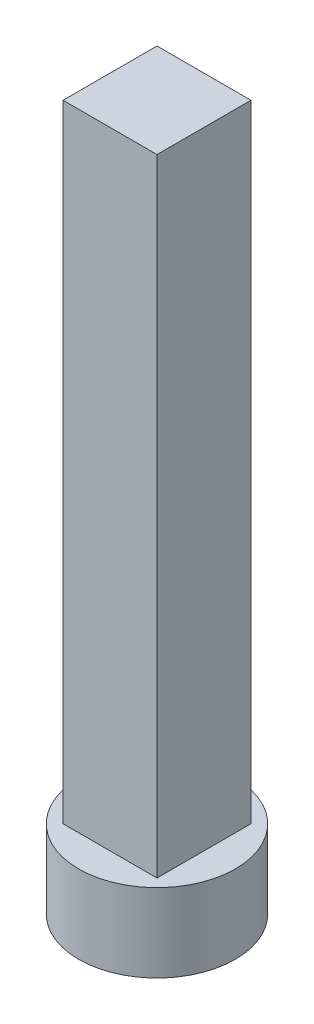
ISO-10303-21;
HEADER;
FILE_DESCRIPTION(('STEP AP214'),'2;1');
FILE_NAME('part.step','',(''),(''),'','','');
FILE_SCHEMA(('AUTOMOTIVE_DESIGN { 1 0 10303 214 1 1 1 1 }'));
ENDSEC;
DATA;
#1=APPLICATION_CONTEXT('core data for automotive mechanical design processes');
#2=APPLICATION_PROTOCOL_DEFINITION('international standard','automotive_design',2000,#1);
#3=PRODUCT_CONTEXT('',#1,'mechanical');
#4=PRODUCT('Part','Part','',(#3));
#5=PRODUCT_RELATED_PRODUCT_CATEGORY('part','',(#4));
#6=PRODUCT_DEFINITION_FORMATION('','',#4);
#7=PRODUCT_DEFINITION_CONTEXT('part definition',#1,'design');
#8=PRODUCT_DEFINITION('design','',#6,#7);
#9=PRODUCT_DEFINITION_SHAPE('','',#8);
#10=(LENGTH_UNIT() NAMED_UNIT(*) SI_UNIT(.MILLI.,.METRE.));
#11=(NAMED_UNIT(*) PLANE_ANGLE_UNIT() SI_UNIT($,.RADIAN.));
#12=(NAMED_UNIT(*) SI_UNIT($,.STERADIAN.) SOLID_ANGLE_UNIT());
#13=UNCERTAINTY_MEASURE_WITH_UNIT(LENGTH_MEASURE(1.E-05),#10,'distance_accuracy_value','');
#14=(GEOMETRIC_REPRESENTATION_CONTEXT(3) GLOBAL_UNCERTAINTY_ASSIGNED_CONTEXT((#13)) GLOBAL_UNIT_ASSIGNED_CONTEXT((#10,
#11,#12)) REPRESENTATION_CONTEXT('',''));
#15=CARTESIAN_POINT('',(0.,0.,0.));
#16=DIRECTION('',(0.,0.,1.));
#17=DIRECTION('',(1.,0.,0.));
#18=AXIS2_PLACEMENT_3D('',#15,#16,#17);
#19=CARTESIAN_POINT('',(30.,400.,-30.));
#20=DIRECTION('',(-1.,0.,0.));
#21=DIRECTION('',(0.,0.,1.));
#22=AXIS2_PLACEMENT_3D('',#19,#20,#21);
#23=PLANE('',#22);
#24=DIRECTION('',(0.,0.,-1.));
#25=VECTOR('',#24,1.);
#26=CARTESIAN_POINT('',(30.,0.,-30.));
#27=LINE('',#26,#25);
#28=CARTESIAN_POINT('',(30.,0.,30.));
#29=VERTEX_POINT('',#28);
#30=CARTESIAN_POINT('',(30.,0.,-30.));
#31=VERTEX_POINT('',#30);
#32=EDGE_CURVE('E77',#29,#31,#27,.T.);
#33=ORIENTED_EDGE('',*,*,#32,.T.);
#34=DIRECTION('',(0.,-1.,0.));
#35=VECTOR('',#34,1.);
#36=CARTESIAN_POINT('',(30.,400.,-30.));
#37=LINE('',#36,#35);
#38=CARTESIAN_POINT('',(30.,400.,-30.));
#39=VERTEX_POINT('',#38);
#40=EDGE_CURVE('E11',#39,#31,#37,.T.);
#41=ORIENTED_EDGE('',*,*,#40,.F.);
#42=DIRECTION('',(0.,0.,-1.));
#43=VECTOR('',#42,1.);
#44=CARTESIAN_POINT('',(30.,400.,-30.));
#45=LINE('',#44,#43);
#46=CARTESIAN_POINT('',(30.,400.,30.));
#47=VERTEX_POINT('',#46);
#48=EDGE_CURVE('E103',#47,#39,#45,.T.);
#49=ORIENTED_EDGE('',*,*,#48,.F.);
#50=DIRECTION('',(0.,-1.,0.));
#51=VECTOR('',#50,1.);
#52=CARTESIAN_POINT('',(30.,400.,30.));
#53=LINE('',#52,#51);
#54=EDGE_CURVE('E91',#47,#29,#53,.T.);
#55=ORIENTED_EDGE('',*,*,#54,.T.);
#56=EDGE_LOOP('',(#33,#41,#49,#55));
#57=FACE_BOUND('',#56,.T.);
#58=ADVANCED_FACE('F37',(#57),#23,.F.);
#59=CARTESIAN_POINT('',(-30.,400.,-30.));
#60=DIRECTION('',(0.,0.,1.));
#61=DIRECTION('',(1.,0.,0.));
#62=AXIS2_PLACEMENT_3D('',#59,#60,#61);
#63=PLANE('',#62);
#64=DIRECTION('',(-1.,0.,0.));
#65=VECTOR('',#64,1.);
#66=CARTESIAN_POINT('',(-30.,0.,-30.));
#67=LINE('',#66,#65);
#68=CARTESIAN_POINT('',(-30.,0.,-30.));
#69=VERTEX_POINT('',#68);
#70=EDGE_CURVE('E73',#31,#69,#67,.T.);
#71=ORIENTED_EDGE('',*,*,#70,.T.);
#72=DIRECTION('',(0.,-1.,0.));
#73=VECTOR('',#72,1.);
#74=CARTESIAN_POINT('',(-30.,400.,-30.));
#75=LINE('',#74,#73);
#76=CARTESIAN_POINT('',(-30.,400.,-30.));
#77=VERTEX_POINT('',#76);
#78=EDGE_CURVE('E45',#77,#69,#75,.T.);
#79=ORIENTED_EDGE('',*,*,#78,.F.);
#80=DIRECTION('',(-1.,0.,0.));
#81=VECTOR('',#80,1.);
#82=CARTESIAN_POINT('',(-30.,400.,-30.));
#83=LINE('',#82,#81);
#84=EDGE_CURVE('E87',#39,#77,#83,.T.);
#85=ORIENTED_EDGE('',*,*,#84,.F.);
#86=ORIENTED_EDGE('',*,*,#40,.T.);
#87=EDGE_LOOP('',(#71,#79,#85,#86));
#88=FACE_BOUND('',#87,.T.);
#89=ADVANCED_FACE('F86',(#88),#63,.F.);
#90=CARTESIAN_POINT('',(-30.,400.,-30.));
#91=DIRECTION('',(1.,0.,0.));
#92=DIRECTION('',(0.,0.,-1.));
#93=AXIS2_PLACEMENT_3D('',#90,#91,#92);
#94=PLANE('',#93);
#95=DIRECTION('',(0.,0.,1.));
#96=VECTOR('',#95,1.);
#97=CARTESIAN_POINT('',(-30.,0.,-30.));
#98=LINE('',#97,#96);
#99=CARTESIAN_POINT('',(-30.,0.,30.));
#100=VERTEX_POINT('',#99);
#101=EDGE_CURVE('E80',#69,#100,#98,.T.);
#102=ORIENTED_EDGE('',*,*,#101,.T.);
#103=DIRECTION('',(0.,-1.,0.));
#104=VECTOR('',#103,1.);
#105=CARTESIAN_POINT('',(-30.,400.,30.));
#106=LINE('',#105,#104);
#107=CARTESIAN_POINT('',(-30.,400.,30.));
#108=VERTEX_POINT('',#107);
#109=EDGE_CURVE('E105',#108,#100,#106,.T.);
#110=ORIENTED_EDGE('',*,*,#109,.F.);
#111=DIRECTION('',(0.,0.,1.));
#112=VECTOR('',#111,1.);
#113=CARTESIAN_POINT('',(-30.,400.,-30.));
#114=LINE('',#113,#112);
#115=EDGE_CURVE('E111',#77,#108,#114,.T.);
#116=ORIENTED_EDGE('',*,*,#115,.F.);
#117=ORIENTED_EDGE('',*,*,#78,.T.);
#118=EDGE_LOOP('',(#102,#110,#116,#117));
#119=FACE_BOUND('',#118,.T.);
#120=ADVANCED_FACE('F109',(#119),#94,.F.);
#121=CARTESIAN_POINT('',(-30.,400.,30.));
#122=DIRECTION('',(0.,0.,-1.));
#123=DIRECTION('',(-1.,0.,0.));
#124=AXIS2_PLACEMENT_3D('',#121,#122,#123);
#125=PLANE('',#124);
#126=DIRECTION('',(1.,0.,0.));
#127=VECTOR('',#126,1.);
#128=CARTESIAN_POINT('',(-30.,0.,30.));
#129=LINE('',#128,#127);
#130=EDGE_CURVE('E101',#100,#29,#129,.T.);
#131=ORIENTED_EDGE('',*,*,#130,.T.);
#132=ORIENTED_EDGE('',*,*,#54,.F.);
#133=DIRECTION('',(1.,0.,0.));
#134=VECTOR('',#133,1.);
#135=CARTESIAN_POINT('',(-30.,400.,30.));
#136=LINE('',#135,#134);
#137=EDGE_CURVE('E52',#108,#47,#136,.T.);
#138=ORIENTED_EDGE('',*,*,#137,.F.);
#139=ORIENTED_EDGE('',*,*,#109,.T.);
#140=EDGE_LOOP('',(#131,#132,#138,#139));
#141=FACE_BOUND('',#140,.T.);
#142=ADVANCED_FACE('F135',(#141),#125,.F.);
#143=CARTESIAN_POINT('',(0.,400.,0.));
#144=DIRECTION('',(0.,1.,0.));
#145=DIRECTION('',(0.,0.,1.));
#146=AXIS2_PLACEMENT_3D('',#143,#144,#145);
#147=PLANE('',#146);
#148=ORIENTED_EDGE('',*,*,#48,.T.);
#149=ORIENTED_EDGE('',*,*,#84,.T.);
#150=ORIENTED_EDGE('',*,*,#115,.T.);
#151=ORIENTED_EDGE('',*,*,#137,.T.);
#152=EDGE_LOOP('',(#148,#149,#150,#151));
#153=FACE_BOUND('',#152,.T.);
#154=ADVANCED_FACE('F140',(#153),#147,.T.);
#155=CARTESIAN_POINT('',(0.,-50.,0.));
#156=DIRECTION('',(0.,1.,0.));
#157=DIRECTION('',(0.,0.,1.));
#158=AXIS2_PLACEMENT_3D('',#155,#156,#157);
#159=CYLINDRICAL_SURFACE('',#158,50.);
#160=CARTESIAN_POINT('',(0.,-50.,0.));
#161=DIRECTION('',(0.,-1.,0.));
#162=DIRECTION('',(0.,0.,-1.));
#163=AXIS2_PLACEMENT_3D('',#160,#161,#162);
#164=CIRCLE('',#163,50.);
#165=CARTESIAN_POINT('',(0.,-50.,-50.));
#166=VERTEX_POINT('',#165);
#167=EDGE_CURVE('E92',#166,#166,#164,.T.);
#168=ORIENTED_EDGE('',*,*,#167,.F.);
#169=EDGE_LOOP('',(#168));
#170=FACE_BOUND('',#169,.T.);
#171=CARTESIAN_POINT('',(0.,0.,0.));
#172=DIRECTION('',(0.,-1.,0.));
#173=DIRECTION('',(0.,0.,-1.));
#174=AXIS2_PLACEMENT_3D('',#171,#172,#173);
#175=CIRCLE('',#174,50.);
#176=CARTESIAN_POINT('',(0.,0.,-50.));
#177=VERTEX_POINT('',#176);
#178=EDGE_CURVE('E95',#177,#177,#175,.T.);
#179=ORIENTED_EDGE('',*,*,#178,.T.);
#180=EDGE_LOOP('',(#179));
#181=FACE_BOUND('',#180,.T.);
#182=ADVANCED_FACE('F118',(#170,#181),#159,.T.);
#183=CARTESIAN_POINT('',(0.,-50.,0.));
#184=DIRECTION('',(0.,-1.,0.));
#185=DIRECTION('',(0.,0.,-1.));
#186=AXIS2_PLACEMENT_3D('',#183,#184,#185);
#187=PLANE('',#186);
#188=ORIENTED_EDGE('',*,*,#167,.T.);
#189=EDGE_LOOP('',(#188));
#190=FACE_BOUND('',#189,.T.);
#191=ADVANCED_FACE('F120',(#190),#187,.T.);
#192=CARTESIAN_POINT('',(0.,0.,0.));
#193=DIRECTION('',(0.,-1.,0.));
#194=DIRECTION('',(0.,0.,-1.));
#195=AXIS2_PLACEMENT_3D('',#192,#193,#194);
#196=PLANE('',#195);
#197=ORIENTED_EDGE('',*,*,#32,.F.);
#198=ORIENTED_EDGE('',*,*,#130,.F.);
#199=ORIENTED_EDGE('',*,*,#101,.F.);
#200=ORIENTED_EDGE('',*,*,#70,.F.);
#201=EDGE_LOOP('',(#197,#198,#199,#200));
#202=FACE_BOUND('',#201,.T.);
#203=ORIENTED_EDGE('',*,*,#178,.F.);
#204=EDGE_LOOP('',(#203));
#205=FACE_BOUND('',#204,.T.);
#206=ADVANCED_FACE('F74',(#202,#205),#196,.F.);
#207=CLOSED_SHELL('',(#58,#89,#120,#142,#154,#182,#191,#206));
#208=MANIFOLD_SOLID_BREP('B2',#207);
#209=ADVANCED_BREP_SHAPE_REPRESENTATION('',(#18,#208),#14);
#210=SHAPE_DEFINITION_REPRESENTATION(#9,#209);
ENDSEC;
END-ISO-10303-21;
